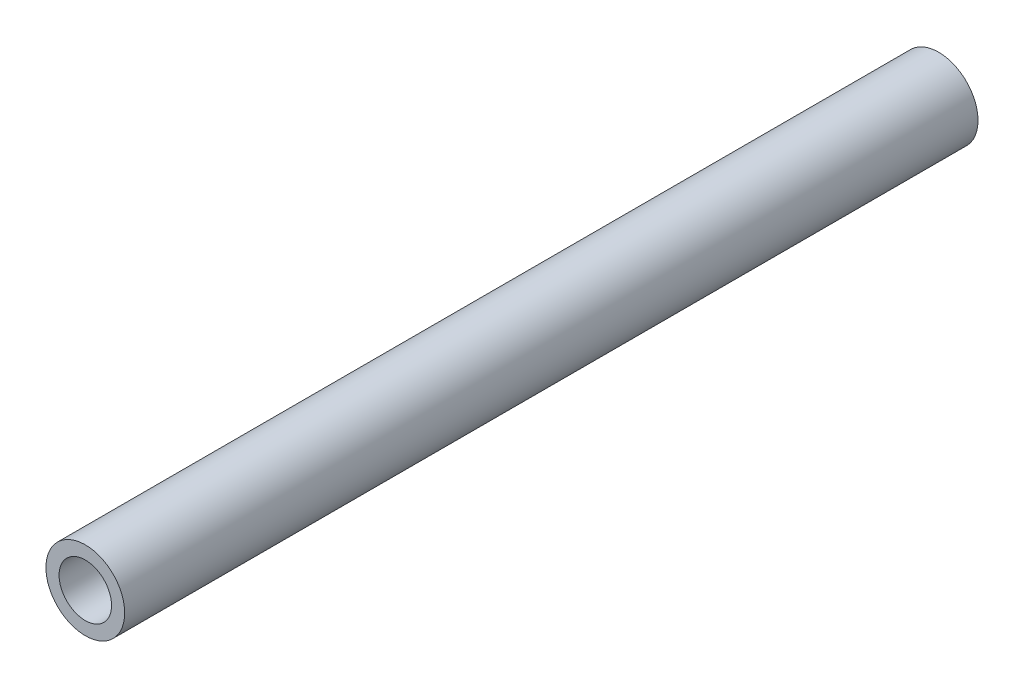
ISO-10303-21;
HEADER;
FILE_DESCRIPTION(('STEP AP214'),'2;1');
FILE_NAME('part.step','',(''),(''),'','','');
FILE_SCHEMA(('AUTOMOTIVE_DESIGN { 1 0 10303 214 1 1 1 1 }'));
ENDSEC;
DATA;
#1=APPLICATION_CONTEXT('core data for automotive mechanical design processes');
#2=APPLICATION_PROTOCOL_DEFINITION('international standard','automotive_design',2000,#1);
#3=PRODUCT_CONTEXT('',#1,'mechanical');
#4=PRODUCT('Part','Part','',(#3));
#5=PRODUCT_RELATED_PRODUCT_CATEGORY('part','',(#4));
#6=PRODUCT_DEFINITION_FORMATION('','',#4);
#7=PRODUCT_DEFINITION_CONTEXT('part definition',#1,'design');
#8=PRODUCT_DEFINITION('design','',#6,#7);
#9=PRODUCT_DEFINITION_SHAPE('','',#8);
#10=(LENGTH_UNIT() NAMED_UNIT(*) SI_UNIT(.MILLI.,.METRE.));
#11=(NAMED_UNIT(*) PLANE_ANGLE_UNIT() SI_UNIT($,.RADIAN.));
#12=(NAMED_UNIT(*) SI_UNIT($,.STERADIAN.) SOLID_ANGLE_UNIT());
#13=UNCERTAINTY_MEASURE_WITH_UNIT(LENGTH_MEASURE(1.E-05),#10,'distance_accuracy_value','');
#14=(GEOMETRIC_REPRESENTATION_CONTEXT(3) GLOBAL_UNCERTAINTY_ASSIGNED_CONTEXT((#13)) GLOBAL_UNIT_ASSIGNED_CONTEXT((#10,
#11,#12)) REPRESENTATION_CONTEXT('',''));
#15=CARTESIAN_POINT('',(0.,0.,0.));
#16=DIRECTION('',(0.,0.,1.));
#17=DIRECTION('',(1.,0.,0.));
#18=AXIS2_PLACEMENT_3D('',#15,#16,#17);
#19=CARTESIAN_POINT('',(0.,0.,162.5));
#20=DIRECTION('',(0.,0.,1.));
#21=DIRECTION('',(1.,0.,0.));
#22=AXIS2_PLACEMENT_3D('',#19,#20,#21);
#23=PLANE('',#22);
#24=CARTESIAN_POINT('',(0.,0.,162.5));
#25=DIRECTION('',(0.,0.,1.));
#26=DIRECTION('',(1.,0.,0.));
#27=AXIS2_PLACEMENT_3D('',#24,#25,#26);
#28=CIRCLE('',#27,15.);
#29=CARTESIAN_POINT('',(15.,0.,162.5));
#30=VERTEX_POINT('',#29);
#31=EDGE_CURVE('E10',#30,#30,#28,.T.);
#32=ORIENTED_EDGE('',*,*,#31,.T.);
#33=EDGE_LOOP('',(#32));
#34=FACE_BOUND('',#33,.T.);
#35=CARTESIAN_POINT('',(0.,0.,162.5));
#36=DIRECTION('',(0.,0.,1.));
#37=DIRECTION('',(1.,0.,0.));
#38=AXIS2_PLACEMENT_3D('',#35,#36,#37);
#39=CIRCLE('',#38,10.);
#40=CARTESIAN_POINT('',(10.,0.,162.5));
#41=VERTEX_POINT('',#40);
#42=EDGE_CURVE('E49',#41,#41,#39,.T.);
#43=ORIENTED_EDGE('',*,*,#42,.F.);
#44=EDGE_LOOP('',(#43));
#45=FACE_BOUND('',#44,.T.);
#46=ADVANCED_FACE('F39',(#34,#45),#23,.T.);
#47=CARTESIAN_POINT('',(0.,0.,-162.5));
#48=DIRECTION('',(0.,0.,1.));
#49=DIRECTION('',(1.,0.,0.));
#50=AXIS2_PLACEMENT_3D('',#47,#48,#49);
#51=PLANE('',#50);
#52=CARTESIAN_POINT('',(0.,0.,-162.5));
#53=DIRECTION('',(0.,0.,1.));
#54=DIRECTION('',(1.,0.,0.));
#55=AXIS2_PLACEMENT_3D('',#52,#53,#54);
#56=CIRCLE('',#55,15.);
#57=CARTESIAN_POINT('',(15.,0.,-162.5));
#58=VERTEX_POINT('',#57);
#59=EDGE_CURVE('E43',#58,#58,#56,.T.);
#60=ORIENTED_EDGE('',*,*,#59,.F.);
#61=EDGE_LOOP('',(#60));
#62=FACE_BOUND('',#61,.T.);
#63=CARTESIAN_POINT('',(0.,0.,-162.5));
#64=DIRECTION('',(0.,0.,1.));
#65=DIRECTION('',(1.,0.,0.));
#66=AXIS2_PLACEMENT_3D('',#63,#64,#65);
#67=CIRCLE('',#66,10.);
#68=CARTESIAN_POINT('',(10.,0.,-162.5));
#69=VERTEX_POINT('',#68);
#70=EDGE_CURVE('E55',#69,#69,#67,.T.);
#71=ORIENTED_EDGE('',*,*,#70,.T.);
#72=EDGE_LOOP('',(#71));
#73=FACE_BOUND('',#72,.T.);
#74=ADVANCED_FACE('F62',(#62,#73),#51,.F.);
#75=CARTESIAN_POINT('',(0.,0.,162.5));
#76=DIRECTION('',(0.,0.,-1.));
#77=DIRECTION('',(-1.,0.,0.));
#78=AXIS2_PLACEMENT_3D('',#75,#76,#77);
#79=CYLINDRICAL_SURFACE('',#78,15.);
#80=ORIENTED_EDGE('',*,*,#31,.F.);
#81=EDGE_LOOP('',(#80));
#82=FACE_BOUND('',#81,.T.);
#83=ORIENTED_EDGE('',*,*,#59,.T.);
#84=EDGE_LOOP('',(#83));
#85=FACE_BOUND('',#84,.T.);
#86=ADVANCED_FACE('F41',(#82,#85),#79,.T.);
#87=CARTESIAN_POINT('',(0.,0.,162.5));
#88=DIRECTION('',(0.,0.,-1.));
#89=DIRECTION('',(-1.,0.,0.));
#90=AXIS2_PLACEMENT_3D('',#87,#88,#89);
#91=CYLINDRICAL_SURFACE('',#90,10.);
#92=ORIENTED_EDGE('',*,*,#42,.T.);
#93=EDGE_LOOP('',(#92));
#94=FACE_BOUND('',#93,.T.);
#95=ORIENTED_EDGE('',*,*,#70,.F.);
#96=EDGE_LOOP('',(#95));
#97=FACE_BOUND('',#96,.T.);
#98=ADVANCED_FACE('F59',(#94,#97),#91,.F.);
#99=CLOSED_SHELL('',(#46,#74,#86,#98));
#100=MANIFOLD_SOLID_BREP('B2',#99);
#101=ADVANCED_BREP_SHAPE_REPRESENTATION('',(#18,#100),#14);
#102=SHAPE_DEFINITION_REPRESENTATION(#9,#101);
ENDSEC;
END-ISO-10303-21;
